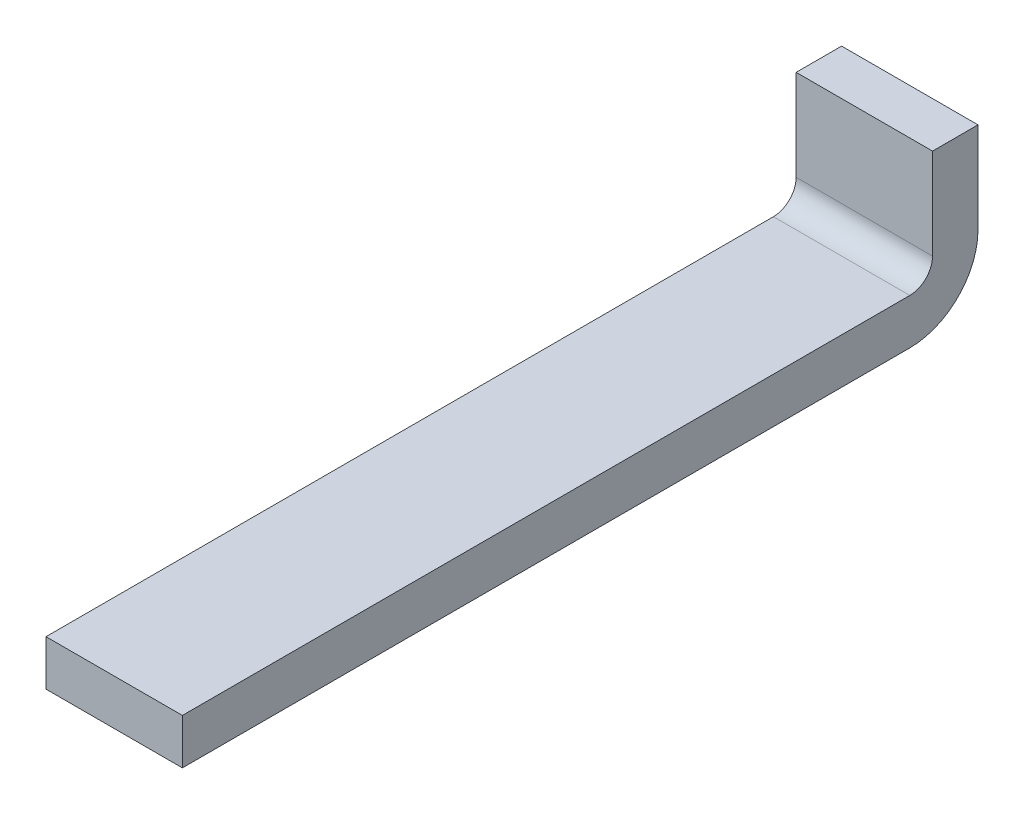
ISO-10303-21;
HEADER;
FILE_DESCRIPTION(('STEP AP214'),'2;1');
FILE_NAME('part.step','',(''),(''),'','','');
FILE_SCHEMA(('AUTOMOTIVE_DESIGN { 1 0 10303 214 1 1 1 1 }'));
ENDSEC;
DATA;
#1=APPLICATION_CONTEXT('core data for automotive mechanical design processes');
#2=APPLICATION_PROTOCOL_DEFINITION('international standard','automotive_design',2000,#1);
#3=PRODUCT_CONTEXT('',#1,'mechanical');
#4=PRODUCT('Part','Part','',(#3));
#5=PRODUCT_RELATED_PRODUCT_CATEGORY('part','',(#4));
#6=PRODUCT_DEFINITION_FORMATION('','',#4);
#7=PRODUCT_DEFINITION_CONTEXT('part definition',#1,'design');
#8=PRODUCT_DEFINITION('design','',#6,#7);
#9=PRODUCT_DEFINITION_SHAPE('','',#8);
#10=(LENGTH_UNIT() NAMED_UNIT(*) SI_UNIT(.MILLI.,.METRE.));
#11=(NAMED_UNIT(*) PLANE_ANGLE_UNIT() SI_UNIT($,.RADIAN.));
#12=(NAMED_UNIT(*) SI_UNIT($,.STERADIAN.) SOLID_ANGLE_UNIT());
#13=UNCERTAINTY_MEASURE_WITH_UNIT(LENGTH_MEASURE(1.E-05),#10,'distance_accuracy_value','');
#14=(GEOMETRIC_REPRESENTATION_CONTEXT(3) GLOBAL_UNCERTAINTY_ASSIGNED_CONTEXT((#13)) GLOBAL_UNIT_ASSIGNED_CONTEXT((#10,
#11,#12)) REPRESENTATION_CONTEXT('',''));
#15=CARTESIAN_POINT('',(0.,0.,0.));
#16=DIRECTION('',(0.,0.,1.));
#17=DIRECTION('',(1.,0.,0.));
#18=AXIS2_PLACEMENT_3D('',#15,#16,#17);
#19=CARTESIAN_POINT('',(-1.798,0.75,0.2));
#20=DIRECTION('',(0.,0.,1.));
#21=DIRECTION('',(1.,0.,0.));
#22=AXIS2_PLACEMENT_3D('',#19,#20,#21);
#23=PLANE('',#22);
#24=DIRECTION('',(-1.,0.,0.));
#25=VECTOR('',#24,1.);
#26=CARTESIAN_POINT('',(-2.098,0.750000001167,0.2));
#27=LINE('',#26,#25);
#28=CARTESIAN_POINT('',(-2.398,0.7500000005835,0.2));
#29=VERTEX_POINT('',#28);
#30=CARTESIAN_POINT('',(-1.798,0.7500000005835,0.2));
#31=VERTEX_POINT('',#30);
#32=EDGE_CURVE('E157',#29,#31,#27,.F.);
#33=ORIENTED_EDGE('',*,*,#32,.T.);
#34=DIRECTION('',(0.,-1.,0.));
#35=VECTOR('',#34,1.);
#36=CARTESIAN_POINT('',(-1.798,0.45,0.2));
#37=LINE('',#36,#35);
#38=CARTESIAN_POINT('',(-1.79800000000001,1.15000000000016,0.2));
#39=VERTEX_POINT('',#38);
#40=EDGE_CURVE('E151',#31,#39,#37,.F.);
#41=ORIENTED_EDGE('',*,*,#40,.T.);
#42=DIRECTION('',(1.,-3.887517478068E-09,0.));
#43=VECTOR('',#42,1.);
#44=CARTESIAN_POINT('',(-2.398,1.150000002333,0.2));
#45=LINE('',#44,#43);
#46=CARTESIAN_POINT('',(-2.398,1.15000000077767,0.2));
#47=VERTEX_POINT('',#46);
#48=EDGE_CURVE('E144',#47,#39,#45,.T.);
#49=ORIENTED_EDGE('',*,*,#48,.F.);
#50=DIRECTION('',(0.,1.,0.));
#51=VECTOR('',#50,1.);
#52=CARTESIAN_POINT('',(-2.398,0.45,0.2));
#53=LINE('',#52,#51);
#54=EDGE_CURVE('E124',#47,#29,#53,.F.);
#55=ORIENTED_EDGE('',*,*,#54,.T.);
#56=EDGE_LOOP('',(#33,#41,#49,#55));
#57=FACE_BOUND('',#56,.T.);
#58=ADVANCED_FACE('F17',(#57),#23,.T.);
#59=CARTESIAN_POINT('',(-2.398,1.150000002333,0.2));
#60=DIRECTION('',(3.887517478068E-09,1.,-1.166255271748E-08));
#61=DIRECTION('',(0.,1.166255271748E-08,1.));
#62=AXIS2_PLACEMENT_3D('',#59,#60,#61);
#63=PLANE('',#62);
#64=ORIENTED_EDGE('',*,*,#48,.T.);
#65=DIRECTION('',(0.,0.,1.));
#66=VECTOR('',#65,1.);
#67=CARTESIAN_POINT('',(-1.79800000000001,1.15,0.300000002333));
#68=LINE('',#67,#66);
#69=CARTESIAN_POINT('',(-1.79800000000001,1.15,0.));
#70=VERTEX_POINT('',#69);
#71=EDGE_CURVE('E147',#39,#70,#68,.F.);
#72=ORIENTED_EDGE('',*,*,#71,.T.);
#73=DIRECTION('',(-1.,0.,0.));
#74=VECTOR('',#73,1.);
#75=CARTESIAN_POINT('',(-1.798,1.15,0.));
#76=LINE('',#75,#74);
#77=CARTESIAN_POINT('',(-2.398,1.15,0.));
#78=VERTEX_POINT('',#77);
#79=EDGE_CURVE('E142',#78,#70,#76,.F.);
#80=ORIENTED_EDGE('',*,*,#79,.F.);
#81=DIRECTION('',(0.,0.,1.));
#82=VECTOR('',#81,1.);
#83=CARTESIAN_POINT('',(-2.398,1.15,0.3));
#84=LINE('',#83,#82);
#85=EDGE_CURVE('E127',#78,#47,#84,.T.);
#86=ORIENTED_EDGE('',*,*,#85,.T.);
#87=EDGE_LOOP('',(#64,#72,#80,#86));
#88=FACE_BOUND('',#87,.T.);
#89=ADVANCED_FACE('F193',(#88),#63,.T.);
#90=CARTESIAN_POINT('',(-1.798,0.749999997667,0.));
#91=DIRECTION('',(0.,0.,-1.));
#92=DIRECTION('',(-1.,0.,0.));
#93=AXIS2_PLACEMENT_3D('',#90,#91,#92);
#94=PLANE('',#93);
#95=DIRECTION('',(-1.,0.,0.));
#96=VECTOR('',#95,1.);
#97=CARTESIAN_POINT('',(-2.098,0.75,0.));
#98=LINE('',#97,#96);
#99=CARTESIAN_POINT('',(-2.398,0.75,0.));
#100=VERTEX_POINT('',#99);
#101=CARTESIAN_POINT('',(-1.798,0.75,0.));
#102=VERTEX_POINT('',#101);
#103=EDGE_CURVE('E84',#100,#102,#98,.F.);
#104=ORIENTED_EDGE('',*,*,#103,.F.);
#105=DIRECTION('',(0.,1.,0.));
#106=VECTOR('',#105,1.);
#107=CARTESIAN_POINT('',(-2.398,0.45,0.));
#108=LINE('',#107,#106);
#109=EDGE_CURVE('E130',#100,#78,#108,.T.);
#110=ORIENTED_EDGE('',*,*,#109,.T.);
#111=ORIENTED_EDGE('',*,*,#79,.T.);
#112=DIRECTION('',(0.,-1.,0.));
#113=VECTOR('',#112,1.);
#114=CARTESIAN_POINT('',(-1.798,0.45,0.));
#115=LINE('',#114,#113);
#116=EDGE_CURVE('E150',#70,#102,#115,.T.);
#117=ORIENTED_EDGE('',*,*,#116,.T.);
#118=EDGE_LOOP('',(#104,#110,#111,#117));
#119=FACE_BOUND('',#118,.T.);
#120=ADVANCED_FACE('F190',(#119),#94,.T.);
#121=CARTESIAN_POINT('',(-2.098,0.75,0.3));
#122=DIRECTION('',(-1.,0.,0.));
#123=DIRECTION('',(0.,0.,1.));
#124=AXIS2_PLACEMENT_3D('',#121,#122,#123);
#125=CYLINDRICAL_SURFACE('',#124,0.3);
#126=DIRECTION('',(-1.,0.,0.));
#127=VECTOR('',#126,1.);
#128=CARTESIAN_POINT('',(-1.798,0.45,0.300000001167));
#129=LINE('',#128,#127);
#130=CARTESIAN_POINT('',(-1.798,0.45,0.3000000005835));
#131=VERTEX_POINT('',#130);
#132=CARTESIAN_POINT('',(-2.398,0.45,0.3000000005835));
#133=VERTEX_POINT('',#132);
#134=EDGE_CURVE('E58',#131,#133,#129,.T.);
#135=ORIENTED_EDGE('',*,*,#134,.T.);
#136=CARTESIAN_POINT('',(-2.398,0.75,0.3));
#137=DIRECTION('',(-1.,0.,0.));
#138=DIRECTION('',(0.,0.,1.));
#139=AXIS2_PLACEMENT_3D('',#136,#137,#138);
#140=CIRCLE('',#139,0.3);
#141=EDGE_CURVE('E20',#133,#100,#140,.F.);
#142=ORIENTED_EDGE('',*,*,#141,.T.);
#143=ORIENTED_EDGE('',*,*,#103,.T.);
#144=CARTESIAN_POINT('',(-1.798,0.75,0.3));
#145=DIRECTION('',(-1.,0.,0.));
#146=DIRECTION('',(0.,0.,1.));
#147=AXIS2_PLACEMENT_3D('',#144,#145,#146);
#148=CIRCLE('',#147,0.3);
#149=EDGE_CURVE('E114',#102,#131,#148,.T.);
#150=ORIENTED_EDGE('',*,*,#149,.T.);
#151=EDGE_LOOP('',(#135,#142,#143,#150));
#152=FACE_BOUND('',#151,.T.);
#153=ADVANCED_FACE('F194',(#152),#125,.T.);
#154=CARTESIAN_POINT('',(-1.798,0.45,0.300000002333));
#155=DIRECTION('',(0.,1.,0.));
#156=DIRECTION('',(-1.,0.,0.));
#157=AXIS2_PLACEMENT_3D('',#154,#155,#156);
#158=PLANE('',#157);
#159=ORIENTED_EDGE('',*,*,#134,.F.);
#160=DIRECTION('',(0.,0.,1.));
#161=VECTOR('',#160,1.);
#162=CARTESIAN_POINT('',(-1.798,0.45,0.300000002333));
#163=LINE('',#162,#161);
#164=CARTESIAN_POINT('',(-1.798,0.45,3.50000000181401));
#165=VERTEX_POINT('',#164);
#166=EDGE_CURVE('E112',#131,#165,#163,.T.);
#167=ORIENTED_EDGE('',*,*,#166,.T.);
#168=DIRECTION('',(1.,0.,3.887517478068E-09));
#169=VECTOR('',#168,1.);
#170=CARTESIAN_POINT('',(-2.398,0.45,3.49999999999951));
#171=LINE('',#170,#169);
#172=CARTESIAN_POINT('',(-2.398,0.45,3.4999999992225));
#173=VERTEX_POINT('',#172);
#174=EDGE_CURVE('E68',#165,#173,#171,.F.);
#175=ORIENTED_EDGE('',*,*,#174,.T.);
#176=DIRECTION('',(0.,0.,1.));
#177=VECTOR('',#176,1.);
#178=CARTESIAN_POINT('',(-2.398,0.45,0.3));
#179=LINE('',#178,#177);
#180=EDGE_CURVE('E102',#173,#133,#179,.F.);
#181=ORIENTED_EDGE('',*,*,#180,.T.);
#182=EDGE_LOOP('',(#159,#167,#175,#181));
#183=FACE_BOUND('',#182,.T.);
#184=ADVANCED_FACE('F196',(#183),#158,.F.);
#185=CARTESIAN_POINT('',(-2.398,0.65,3.499999997667));
#186=DIRECTION('',(3.887517478068E-09,-1.166255265625E-08,-1.));
#187=DIRECTION('',(0.,1.,-1.166255265625E-08));
#188=AXIS2_PLACEMENT_3D('',#185,#186,#187);
#189=PLANE('',#188);
#190=ORIENTED_EDGE('',*,*,#174,.F.);
#191=DIRECTION('',(0.,-1.,0.));
#192=VECTOR('',#191,1.);
#193=CARTESIAN_POINT('',(-1.798,0.45,3.500000001555));
#194=LINE('',#193,#192);
#195=CARTESIAN_POINT('',(-1.798,0.650000000000001,3.50000000051833));
#196=VERTEX_POINT('',#195);
#197=EDGE_CURVE('E111',#165,#196,#194,.F.);
#198=ORIENTED_EDGE('',*,*,#197,.T.);
#199=DIRECTION('',(1.,0.,0.));
#200=VECTOR('',#199,1.);
#201=CARTESIAN_POINT('',(-1.798,0.650000000000001,3.5));
#202=LINE('',#201,#200);
#203=CARTESIAN_POINT('',(-2.398,0.650000000000001,3.49999999961133));
#204=VERTEX_POINT('',#203);
#205=EDGE_CURVE('E92',#196,#204,#202,.F.);
#206=ORIENTED_EDGE('',*,*,#205,.T.);
#207=DIRECTION('',(0.,1.,0.));
#208=VECTOR('',#207,1.);
#209=CARTESIAN_POINT('',(-2.398,0.45,3.499999998834));
#210=LINE('',#209,#208);
#211=EDGE_CURVE('E98',#204,#173,#210,.F.);
#212=ORIENTED_EDGE('',*,*,#211,.T.);
#213=EDGE_LOOP('',(#190,#198,#206,#212));
#214=FACE_BOUND('',#213,.T.);
#215=ADVANCED_FACE('F109',(#214),#189,.F.);
#216=CARTESIAN_POINT('',(-2.398,0.45,0.3));
#217=DIRECTION('',(1.,0.,0.));
#218=DIRECTION('',(0.,1.,0.));
#219=AXIS2_PLACEMENT_3D('',#216,#217,#218);
#220=PLANE('',#219);
#221=CARTESIAN_POINT('',(-2.398,0.75,0.3));
#222=DIRECTION('',(-1.,0.,0.));
#223=DIRECTION('',(0.,0.,1.));
#224=AXIS2_PLACEMENT_3D('',#221,#222,#223);
#225=CIRCLE('',#224,0.1);
#226=CARTESIAN_POINT('',(-2.398,0.65,0.2999999994165));
#227=VERTEX_POINT('',#226);
#228=EDGE_CURVE('E126',#227,#29,#225,.F.);
#229=ORIENTED_EDGE('',*,*,#228,.T.);
#230=ORIENTED_EDGE('',*,*,#54,.F.);
#231=ORIENTED_EDGE('',*,*,#85,.F.);
#232=ORIENTED_EDGE('',*,*,#109,.F.);
#233=ORIENTED_EDGE('',*,*,#141,.F.);
#234=ORIENTED_EDGE('',*,*,#180,.F.);
#235=ORIENTED_EDGE('',*,*,#211,.F.);
#236=DIRECTION('',(0.,0.,1.));
#237=VECTOR('',#236,1.);
#238=CARTESIAN_POINT('',(-2.398,0.65,0.3));
#239=LINE('',#238,#237);
#240=EDGE_CURVE('E101',#204,#227,#239,.F.);
#241=ORIENTED_EDGE('',*,*,#240,.T.);
#242=EDGE_LOOP('',(#229,#230,#231,#232,#233,#234,#235,#241));
#243=FACE_BOUND('',#242,.T.);
#244=ADVANCED_FACE('F100',(#243),#220,.F.);
#245=CARTESIAN_POINT('',(-2.098,0.75,0.3));
#246=DIRECTION('',(-1.,0.,0.));
#247=DIRECTION('',(0.,0.,1.));
#248=AXIS2_PLACEMENT_3D('',#245,#246,#247);
#249=CYLINDRICAL_SURFACE('',#248,0.1);
#250=ORIENTED_EDGE('',*,*,#32,.F.);
#251=ORIENTED_EDGE('',*,*,#228,.F.);
#252=DIRECTION('',(1.,0.,0.));
#253=VECTOR('',#252,1.);
#254=CARTESIAN_POINT('',(-1.798,0.65,0.299999998833));
#255=LINE('',#254,#253);
#256=CARTESIAN_POINT('',(-1.798,0.65,0.2999999994165));
#257=VERTEX_POINT('',#256);
#258=EDGE_CURVE('E26',#227,#257,#255,.T.);
#259=ORIENTED_EDGE('',*,*,#258,.T.);
#260=CARTESIAN_POINT('',(-1.798,0.75,0.3));
#261=DIRECTION('',(-1.,0.,0.));
#262=DIRECTION('',(0.,0.,1.));
#263=AXIS2_PLACEMENT_3D('',#260,#261,#262);
#264=CIRCLE('',#263,0.1);
#265=EDGE_CURVE('E34',#257,#31,#264,.F.);
#266=ORIENTED_EDGE('',*,*,#265,.T.);
#267=EDGE_LOOP('',(#250,#251,#259,#266));
#268=FACE_BOUND('',#267,.T.);
#269=ADVANCED_FACE('F171',(#268),#249,.F.);
#270=CARTESIAN_POINT('',(-1.798,0.45,0.300000002333));
#271=DIRECTION('',(-1.,0.,0.));
#272=DIRECTION('',(0.,-1.,0.));
#273=AXIS2_PLACEMENT_3D('',#270,#271,#272);
#274=PLANE('',#273);
#275=ORIENTED_EDGE('',*,*,#149,.F.);
#276=ORIENTED_EDGE('',*,*,#116,.F.);
#277=ORIENTED_EDGE('',*,*,#71,.F.);
#278=ORIENTED_EDGE('',*,*,#40,.F.);
#279=ORIENTED_EDGE('',*,*,#265,.F.);
#280=DIRECTION('',(0.,0.,1.));
#281=VECTOR('',#280,1.);
#282=CARTESIAN_POINT('',(-1.798,0.65,0.3));
#283=LINE('',#282,#281);
#284=EDGE_CURVE('E11',#257,#196,#283,.T.);
#285=ORIENTED_EDGE('',*,*,#284,.T.);
#286=ORIENTED_EDGE('',*,*,#197,.F.);
#287=ORIENTED_EDGE('',*,*,#166,.F.);
#288=EDGE_LOOP('',(#275,#276,#277,#278,#279,#285,#286,#287));
#289=FACE_BOUND('',#288,.T.);
#290=ADVANCED_FACE('F175',(#289),#274,.F.);
#291=CARTESIAN_POINT('',(-1.798,0.65,0.3));
#292=DIRECTION('',(0.,-1.,0.));
#293=DIRECTION('',(1.,0.,0.));
#294=AXIS2_PLACEMENT_3D('',#291,#292,#293);
#295=PLANE('',#294);
#296=ORIENTED_EDGE('',*,*,#258,.F.);
#297=ORIENTED_EDGE('',*,*,#240,.F.);
#298=ORIENTED_EDGE('',*,*,#205,.F.);
#299=ORIENTED_EDGE('',*,*,#284,.F.);
#300=EDGE_LOOP('',(#296,#297,#298,#299));
#301=FACE_BOUND('',#300,.T.);
#302=ADVANCED_FACE('F106',(#301),#295,.F.);
#303=CLOSED_SHELL('',(#58,#89,#120,#153,#184,#215,#244,#269,#290,#302));
#304=MANIFOLD_SOLID_BREP('B1',#303);
#305=ADVANCED_BREP_SHAPE_REPRESENTATION('',(#18,#304),#14);
#306=SHAPE_DEFINITION_REPRESENTATION(#9,#305);
ENDSEC;
END-ISO-10303-21;
